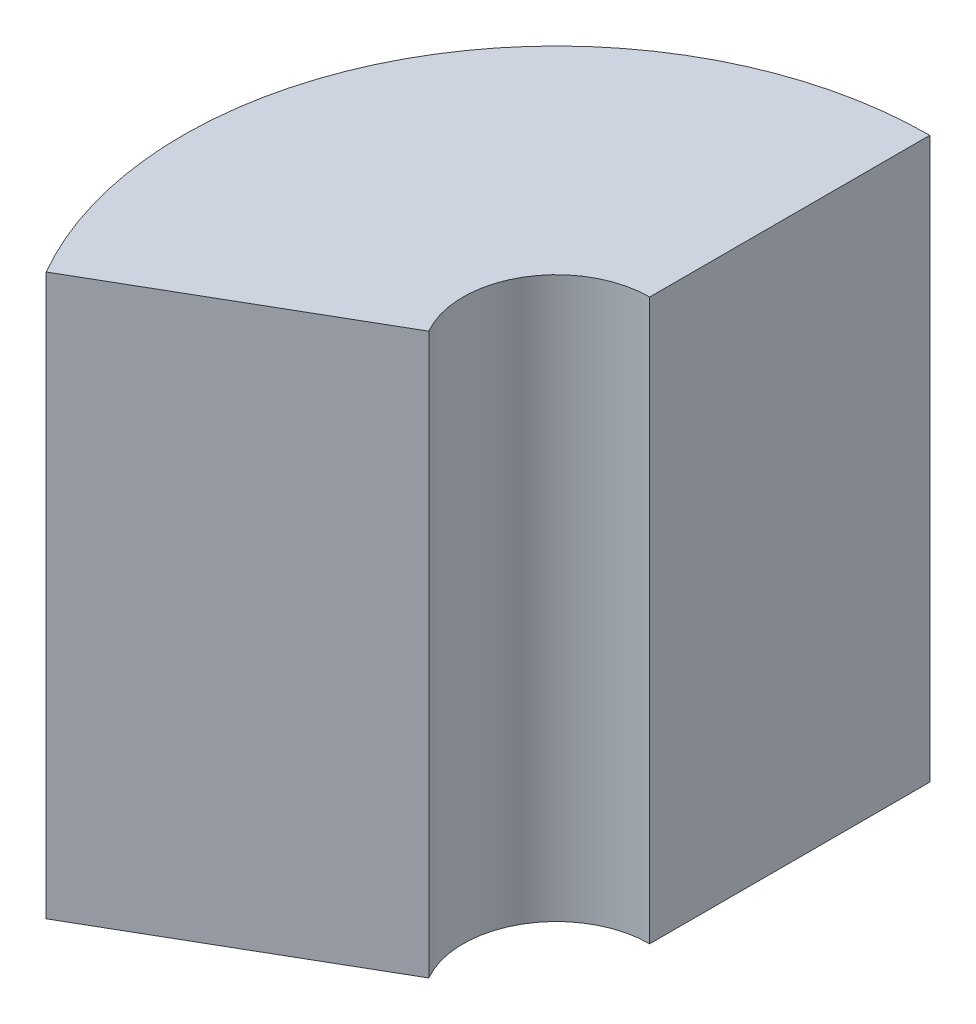
ISO-10303-21;
HEADER;
FILE_DESCRIPTION(('STEP AP214'),'2;1');
FILE_NAME('part.step','',(''),(''),'','','');
FILE_SCHEMA(('AUTOMOTIVE_DESIGN { 1 0 10303 214 1 1 1 1 }'));
ENDSEC;
DATA;
#1=APPLICATION_CONTEXT('core data for automotive mechanical design processes');
#2=APPLICATION_PROTOCOL_DEFINITION('international standard','automotive_design',2000,#1);
#3=PRODUCT_CONTEXT('',#1,'mechanical');
#4=PRODUCT('Part','Part','',(#3));
#5=PRODUCT_RELATED_PRODUCT_CATEGORY('part','',(#4));
#6=PRODUCT_DEFINITION_FORMATION('','',#4);
#7=PRODUCT_DEFINITION_CONTEXT('part definition',#1,'design');
#8=PRODUCT_DEFINITION('design','',#6,#7);
#9=PRODUCT_DEFINITION_SHAPE('','',#8);
#10=(LENGTH_UNIT() NAMED_UNIT(*) SI_UNIT(.MILLI.,.METRE.));
#11=(NAMED_UNIT(*) PLANE_ANGLE_UNIT() SI_UNIT($,.RADIAN.));
#12=(NAMED_UNIT(*) SI_UNIT($,.STERADIAN.) SOLID_ANGLE_UNIT());
#13=UNCERTAINTY_MEASURE_WITH_UNIT(LENGTH_MEASURE(1.E-05),#10,'distance_accuracy_value','');
#14=(GEOMETRIC_REPRESENTATION_CONTEXT(3) GLOBAL_UNCERTAINTY_ASSIGNED_CONTEXT((#13)) GLOBAL_UNIT_ASSIGNED_CONTEXT((#10,
#11,#12)) REPRESENTATION_CONTEXT('',''));
#15=CARTESIAN_POINT('',(0.,0.,0.));
#16=DIRECTION('',(0.,0.,1.));
#17=DIRECTION('',(1.,0.,0.));
#18=AXIS2_PLACEMENT_3D('',#15,#16,#17);
#19=CARTESIAN_POINT('',(0.,0.,0.));
#20=DIRECTION('',(0.,-1.,0.));
#21=DIRECTION('',(0.,0.,-1.));
#22=AXIS2_PLACEMENT_3D('',#19,#20,#21);
#23=CYLINDRICAL_SURFACE('',#22,5.);
#24=CARTESIAN_POINT('',(0.,0.,0.));
#25=DIRECTION('',(0.,-1.,0.));
#26=DIRECTION('',(0.,0.,-1.));
#27=AXIS2_PLACEMENT_3D('',#24,#25,#26);
#28=CIRCLE('',#27,5.);
#29=CARTESIAN_POINT('',(-4.33012701892219,0.,2.5));
#30=VERTEX_POINT('',#29);
#31=CARTESIAN_POINT('',(0.,0.,-5.));
#32=VERTEX_POINT('',#31);
#33=EDGE_CURVE('E11',#30,#32,#28,.T.);
#34=ORIENTED_EDGE('',*,*,#33,.T.);
#35=DIRECTION('',(0.,-1.,0.));
#36=VECTOR('',#35,1.);
#37=CARTESIAN_POINT('',(0.,30.,-5.));
#38=LINE('',#37,#36);
#39=CARTESIAN_POINT('',(0.,30.,-5.));
#40=VERTEX_POINT('',#39);
#41=EDGE_CURVE('E81',#40,#32,#38,.T.);
#42=ORIENTED_EDGE('',*,*,#41,.F.);
#43=CARTESIAN_POINT('',(0.,30.,0.));
#44=DIRECTION('',(0.,-1.,0.));
#45=DIRECTION('',(0.,0.,-1.));
#46=AXIS2_PLACEMENT_3D('',#43,#44,#45);
#47=CIRCLE('',#46,5.);
#48=CARTESIAN_POINT('',(-4.33012701892219,30.,2.5));
#49=VERTEX_POINT('',#48);
#50=EDGE_CURVE('E56',#49,#40,#47,.T.);
#51=ORIENTED_EDGE('',*,*,#50,.F.);
#52=DIRECTION('',(0.,-1.,0.));
#53=VECTOR('',#52,1.);
#54=CARTESIAN_POINT('',(-4.33012701892219,30.,2.5));
#55=LINE('',#54,#53);
#56=EDGE_CURVE('E83',#49,#30,#55,.T.);
#57=ORIENTED_EDGE('',*,*,#56,.T.);
#58=EDGE_LOOP('',(#34,#42,#51,#57));
#59=FACE_BOUND('',#58,.T.);
#60=ADVANCED_FACE('F41',(#59),#23,.F.);
#61=CARTESIAN_POINT('',(-4.33012701892219,0.,2.5));
#62=DIRECTION('',(0.,-1.,0.));
#63=DIRECTION('',(0.,0.,-1.));
#64=AXIS2_PLACEMENT_3D('',#61,#62,#63);
#65=PLANE('',#64);
#66=CARTESIAN_POINT('',(0.,0.,0.));
#67=DIRECTION('',(0.,-1.,0.));
#68=DIRECTION('',(0.,0.,-1.));
#69=AXIS2_PLACEMENT_3D('',#66,#67,#68);
#70=CIRCLE('',#69,20.);
#71=CARTESIAN_POINT('',(-17.3205080756888,0.,9.99999999999999));
#72=VERTEX_POINT('',#71);
#73=CARTESIAN_POINT('',(0.,0.,-20.));
#74=VERTEX_POINT('',#73);
#75=EDGE_CURVE('E49',#72,#74,#70,.T.);
#76=ORIENTED_EDGE('',*,*,#75,.T.);
#77=DIRECTION('',(0.,0.,-1.));
#78=VECTOR('',#77,1.);
#79=CARTESIAN_POINT('',(0.,0.,-5.));
#80=LINE('',#79,#78);
#81=EDGE_CURVE('E92',#32,#74,#80,.T.);
#82=ORIENTED_EDGE('',*,*,#81,.F.);
#83=ORIENTED_EDGE('',*,*,#33,.F.);
#84=DIRECTION('',(-0.866025403784439,0.,0.5));
#85=VECTOR('',#84,1.);
#86=CARTESIAN_POINT('',(-4.33012701892219,0.,2.5));
#87=LINE('',#86,#85);
#88=EDGE_CURVE('E102',#30,#72,#87,.T.);
#89=ORIENTED_EDGE('',*,*,#88,.T.);
#90=EDGE_LOOP('',(#76,#82,#83,#89));
#91=FACE_BOUND('',#90,.T.);
#92=ADVANCED_FACE('F43',(#91),#65,.T.);
#93=CARTESIAN_POINT('',(0.,0.,0.));
#94=DIRECTION('',(0.,-1.,0.));
#95=DIRECTION('',(0.,0.,-1.));
#96=AXIS2_PLACEMENT_3D('',#93,#94,#95);
#97=CYLINDRICAL_SURFACE('',#96,20.);
#98=CARTESIAN_POINT('',(0.,30.,0.));
#99=DIRECTION('',(0.,-1.,0.));
#100=DIRECTION('',(0.,0.,-1.));
#101=AXIS2_PLACEMENT_3D('',#98,#99,#100);
#102=CIRCLE('',#101,20.);
#103=CARTESIAN_POINT('',(-17.3205080756888,30.,9.99999999999999));
#104=VERTEX_POINT('',#103);
#105=CARTESIAN_POINT('',(0.,30.,-20.));
#106=VERTEX_POINT('',#105);
#107=EDGE_CURVE('E64',#104,#106,#102,.T.);
#108=ORIENTED_EDGE('',*,*,#107,.T.);
#109=DIRECTION('',(0.,1.,0.));
#110=VECTOR('',#109,1.);
#111=CARTESIAN_POINT('',(0.,0.,-20.));
#112=LINE('',#111,#110);
#113=EDGE_CURVE('E96',#74,#106,#112,.T.);
#114=ORIENTED_EDGE('',*,*,#113,.F.);
#115=ORIENTED_EDGE('',*,*,#75,.F.);
#116=DIRECTION('',(0.,1.,0.));
#117=VECTOR('',#116,1.);
#118=CARTESIAN_POINT('',(-17.3205080756888,0.,9.99999999999999));
#119=LINE('',#118,#117);
#120=EDGE_CURVE('E104',#72,#104,#119,.T.);
#121=ORIENTED_EDGE('',*,*,#120,.T.);
#122=EDGE_LOOP('',(#108,#114,#115,#121));
#123=FACE_BOUND('',#122,.T.);
#124=ADVANCED_FACE('F110',(#123),#97,.T.);
#125=CARTESIAN_POINT('',(-17.3205080756888,30.,9.99999999999999));
#126=DIRECTION('',(0.,1.,0.));
#127=DIRECTION('',(0.,0.,1.));
#128=AXIS2_PLACEMENT_3D('',#125,#126,#127);
#129=PLANE('',#128);
#130=DIRECTION('',(0.866025403784439,0.,-0.5));
#131=VECTOR('',#130,1.);
#132=CARTESIAN_POINT('',(-17.3205080756888,30.,9.99999999999999));
#133=LINE('',#132,#131);
#134=EDGE_CURVE('E106',#104,#49,#133,.T.);
#135=ORIENTED_EDGE('',*,*,#134,.T.);
#136=ORIENTED_EDGE('',*,*,#50,.T.);
#137=DIRECTION('',(0.,0.,1.));
#138=VECTOR('',#137,1.);
#139=CARTESIAN_POINT('',(0.,30.,-20.));
#140=LINE('',#139,#138);
#141=EDGE_CURVE('E94',#106,#40,#140,.T.);
#142=ORIENTED_EDGE('',*,*,#141,.F.);
#143=ORIENTED_EDGE('',*,*,#107,.F.);
#144=EDGE_LOOP('',(#135,#136,#142,#143));
#145=FACE_BOUND('',#144,.T.);
#146=ADVANCED_FACE('F113',(#145),#129,.T.);
#147=CARTESIAN_POINT('',(0.,0.,0.));
#148=DIRECTION('',(-0.5,0.,-0.866025403784439));
#149=DIRECTION('',(-0.866025403784439,0.,0.5));
#150=AXIS2_PLACEMENT_3D('',#147,#148,#149);
#151=PLANE('',#150);
#152=ORIENTED_EDGE('',*,*,#56,.F.);
#153=ORIENTED_EDGE('',*,*,#134,.F.);
#154=ORIENTED_EDGE('',*,*,#120,.F.);
#155=ORIENTED_EDGE('',*,*,#88,.F.);
#156=EDGE_LOOP('',(#152,#153,#154,#155));
#157=FACE_BOUND('',#156,.T.);
#158=ADVANCED_FACE('F115',(#157),#151,.F.);
#159=CARTESIAN_POINT('',(0.,0.,0.));
#160=DIRECTION('',(1.,0.,0.));
#161=DIRECTION('',(0.,0.,-1.));
#162=AXIS2_PLACEMENT_3D('',#159,#160,#161);
#163=PLANE('',#162);
#164=ORIENTED_EDGE('',*,*,#41,.T.);
#165=ORIENTED_EDGE('',*,*,#81,.T.);
#166=ORIENTED_EDGE('',*,*,#113,.T.);
#167=ORIENTED_EDGE('',*,*,#141,.T.);
#168=EDGE_LOOP('',(#164,#165,#166,#167));
#169=FACE_BOUND('',#168,.T.);
#170=ADVANCED_FACE('F90',(#169),#163,.T.);
#171=CLOSED_SHELL('',(#60,#92,#124,#146,#158,#170));
#172=MANIFOLD_SOLID_BREP('B2',#171);
#173=ADVANCED_BREP_SHAPE_REPRESENTATION('',(#18,#172),#14);
#174=SHAPE_DEFINITION_REPRESENTATION(#9,#173);
ENDSEC;
END-ISO-10303-21;
